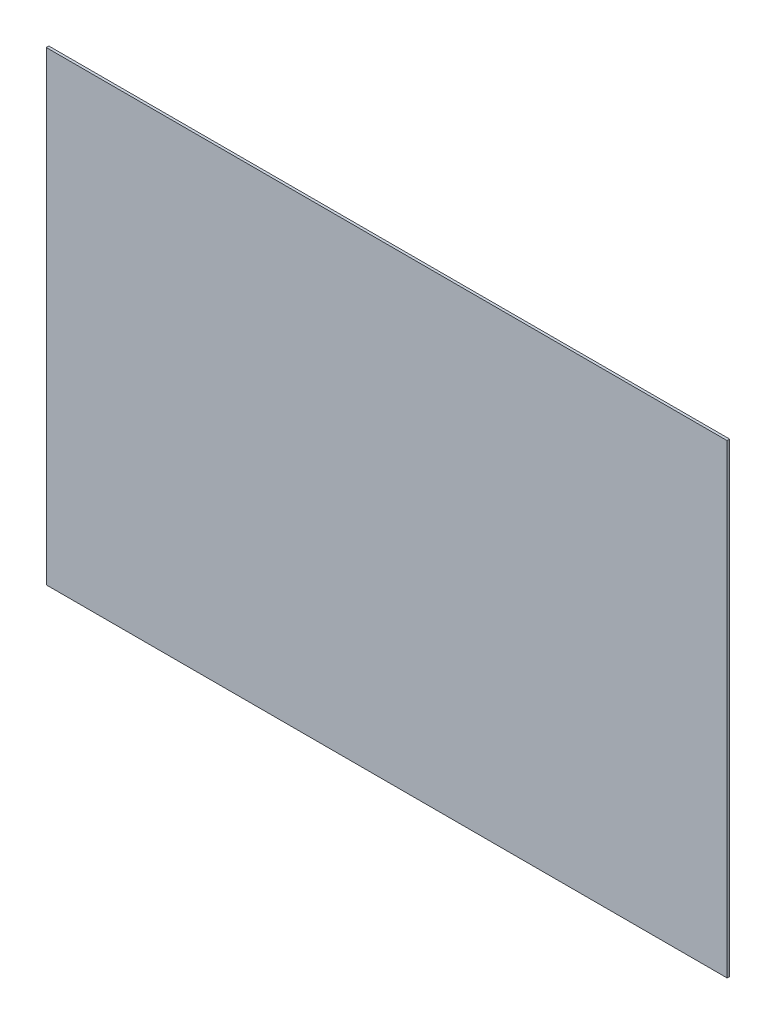
ISO-10303-21;
HEADER;
FILE_DESCRIPTION(('STEP AP214'),'2;1');
FILE_NAME('part.step','',(''),(''),'','','');
FILE_SCHEMA(('AUTOMOTIVE_DESIGN { 1 0 10303 214 1 1 1 1 }'));
ENDSEC;
DATA;
#1=APPLICATION_CONTEXT('core data for automotive mechanical design processes');
#2=APPLICATION_PROTOCOL_DEFINITION('international standard','automotive_design',2000,#1);
#3=PRODUCT_CONTEXT('',#1,'mechanical');
#4=PRODUCT('Part','Part','',(#3));
#5=PRODUCT_RELATED_PRODUCT_CATEGORY('part','',(#4));
#6=PRODUCT_DEFINITION_FORMATION('','',#4);
#7=PRODUCT_DEFINITION_CONTEXT('part definition',#1,'design');
#8=PRODUCT_DEFINITION('design','',#6,#7);
#9=PRODUCT_DEFINITION_SHAPE('','',#8);
#10=(LENGTH_UNIT() NAMED_UNIT(*) SI_UNIT(.MILLI.,.METRE.));
#11=(NAMED_UNIT(*) PLANE_ANGLE_UNIT() SI_UNIT($,.RADIAN.));
#12=(NAMED_UNIT(*) SI_UNIT($,.STERADIAN.) SOLID_ANGLE_UNIT());
#13=UNCERTAINTY_MEASURE_WITH_UNIT(LENGTH_MEASURE(1.E-05),#10,'distance_accuracy_value','');
#14=(GEOMETRIC_REPRESENTATION_CONTEXT(3) GLOBAL_UNCERTAINTY_ASSIGNED_CONTEXT((#13)) GLOBAL_UNIT_ASSIGNED_CONTEXT((#10,
#11,#12)) REPRESENTATION_CONTEXT('',''));
#15=CARTESIAN_POINT('',(0.,0.,0.));
#16=DIRECTION('',(0.,0.,1.));
#17=DIRECTION('',(1.,0.,0.));
#18=AXIS2_PLACEMENT_3D('',#15,#16,#17);
#19=CARTESIAN_POINT('',(395.,-270.,3.));
#20=DIRECTION('',(-1.,0.,0.));
#21=DIRECTION('',(0.,0.,1.));
#22=AXIS2_PLACEMENT_3D('',#19,#20,#21);
#23=PLANE('',#22);
#24=DIRECTION('',(0.,1.,0.));
#25=VECTOR('',#24,1.);
#26=CARTESIAN_POINT('',(395.,-270.,0.));
#27=LINE('',#26,#25);
#28=CARTESIAN_POINT('',(395.,-270.,0.));
#29=VERTEX_POINT('',#28);
#30=CARTESIAN_POINT('',(395.,270.,0.));
#31=VERTEX_POINT('',#30);
#32=EDGE_CURVE('E95',#29,#31,#27,.T.);
#33=ORIENTED_EDGE('',*,*,#32,.T.);
#34=DIRECTION('',(0.,0.,-1.));
#35=VECTOR('',#34,1.);
#36=CARTESIAN_POINT('',(395.,270.,3.));
#37=LINE('',#36,#35);
#38=CARTESIAN_POINT('',(395.,270.,3.));
#39=VERTEX_POINT('',#38);
#40=EDGE_CURVE('E11',#39,#31,#37,.T.);
#41=ORIENTED_EDGE('',*,*,#40,.F.);
#42=DIRECTION('',(0.,1.,0.));
#43=VECTOR('',#42,1.);
#44=CARTESIAN_POINT('',(395.,-270.,3.));
#45=LINE('',#44,#43);
#46=CARTESIAN_POINT('',(395.,-270.,3.));
#47=VERTEX_POINT('',#46);
#48=EDGE_CURVE('E83',#47,#39,#45,.T.);
#49=ORIENTED_EDGE('',*,*,#48,.F.);
#50=DIRECTION('',(0.,0.,-1.));
#51=VECTOR('',#50,1.);
#52=CARTESIAN_POINT('',(395.,-270.,3.));
#53=LINE('',#52,#51);
#54=EDGE_CURVE('E91',#47,#29,#53,.T.);
#55=ORIENTED_EDGE('',*,*,#54,.T.);
#56=EDGE_LOOP('',(#33,#41,#49,#55));
#57=FACE_BOUND('',#56,.T.);
#58=ADVANCED_FACE('F32',(#57),#23,.F.);
#59=CARTESIAN_POINT('',(-395.,270.,3.));
#60=DIRECTION('',(0.,-1.,0.));
#61=DIRECTION('',(0.,0.,-1.));
#62=AXIS2_PLACEMENT_3D('',#59,#60,#61);
#63=PLANE('',#62);
#64=DIRECTION('',(-1.,0.,0.));
#65=VECTOR('',#64,1.);
#66=CARTESIAN_POINT('',(-395.,270.,0.));
#67=LINE('',#66,#65);
#68=CARTESIAN_POINT('',(-395.,270.,0.));
#69=VERTEX_POINT('',#68);
#70=EDGE_CURVE('E87',#31,#69,#67,.T.);
#71=ORIENTED_EDGE('',*,*,#70,.T.);
#72=DIRECTION('',(0.,0.,-1.));
#73=VECTOR('',#72,1.);
#74=CARTESIAN_POINT('',(-395.,270.,3.));
#75=LINE('',#74,#73);
#76=CARTESIAN_POINT('',(-395.,270.,3.));
#77=VERTEX_POINT('',#76);
#78=EDGE_CURVE('E40',#77,#69,#75,.T.);
#79=ORIENTED_EDGE('',*,*,#78,.F.);
#80=DIRECTION('',(-1.,0.,0.));
#81=VECTOR('',#80,1.);
#82=CARTESIAN_POINT('',(-395.,270.,3.));
#83=LINE('',#82,#81);
#84=EDGE_CURVE('E78',#39,#77,#83,.T.);
#85=ORIENTED_EDGE('',*,*,#84,.F.);
#86=ORIENTED_EDGE('',*,*,#40,.T.);
#87=EDGE_LOOP('',(#71,#79,#85,#86));
#88=FACE_BOUND('',#87,.T.);
#89=ADVANCED_FACE('F86',(#88),#63,.F.);
#90=CARTESIAN_POINT('',(-395.,-270.,3.));
#91=DIRECTION('',(1.,0.,0.));
#92=DIRECTION('',(0.,0.,-1.));
#93=AXIS2_PLACEMENT_3D('',#90,#91,#92);
#94=PLANE('',#93);
#95=DIRECTION('',(0.,-1.,0.));
#96=VECTOR('',#95,1.);
#97=CARTESIAN_POINT('',(-395.,-270.,0.));
#98=LINE('',#97,#96);
#99=CARTESIAN_POINT('',(-395.,-270.,0.));
#100=VERTEX_POINT('',#99);
#101=EDGE_CURVE('E65',#69,#100,#98,.T.);
#102=ORIENTED_EDGE('',*,*,#101,.T.);
#103=DIRECTION('',(0.,0.,-1.));
#104=VECTOR('',#103,1.);
#105=CARTESIAN_POINT('',(-395.,-270.,3.));
#106=LINE('',#105,#104);
#107=CARTESIAN_POINT('',(-395.,-270.,3.));
#108=VERTEX_POINT('',#107);
#109=EDGE_CURVE('E88',#108,#100,#106,.T.);
#110=ORIENTED_EDGE('',*,*,#109,.F.);
#111=DIRECTION('',(0.,-1.,0.));
#112=VECTOR('',#111,1.);
#113=CARTESIAN_POINT('',(-395.,-270.,3.));
#114=LINE('',#113,#112);
#115=EDGE_CURVE('E81',#77,#108,#114,.T.);
#116=ORIENTED_EDGE('',*,*,#115,.F.);
#117=ORIENTED_EDGE('',*,*,#78,.T.);
#118=EDGE_LOOP('',(#102,#110,#116,#117));
#119=FACE_BOUND('',#118,.T.);
#120=ADVANCED_FACE('F89',(#119),#94,.F.);
#121=CARTESIAN_POINT('',(-395.,-270.,3.));
#122=DIRECTION('',(0.,1.,0.));
#123=DIRECTION('',(0.,0.,1.));
#124=AXIS2_PLACEMENT_3D('',#121,#122,#123);
#125=PLANE('',#124);
#126=DIRECTION('',(1.,0.,0.));
#127=VECTOR('',#126,1.);
#128=CARTESIAN_POINT('',(-395.,-270.,0.));
#129=LINE('',#128,#127);
#130=EDGE_CURVE('E71',#100,#29,#129,.T.);
#131=ORIENTED_EDGE('',*,*,#130,.T.);
#132=ORIENTED_EDGE('',*,*,#54,.F.);
#133=DIRECTION('',(1.,0.,0.));
#134=VECTOR('',#133,1.);
#135=CARTESIAN_POINT('',(-395.,-270.,3.));
#136=LINE('',#135,#134);
#137=EDGE_CURVE('E48',#108,#47,#136,.T.);
#138=ORIENTED_EDGE('',*,*,#137,.F.);
#139=ORIENTED_EDGE('',*,*,#109,.T.);
#140=EDGE_LOOP('',(#131,#132,#138,#139));
#141=FACE_BOUND('',#140,.T.);
#142=ADVANCED_FACE('F102',(#141),#125,.F.);
#143=CARTESIAN_POINT('',(0.,0.,3.));
#144=DIRECTION('',(0.,0.,-1.));
#145=DIRECTION('',(-1.,0.,0.));
#146=AXIS2_PLACEMENT_3D('',#143,#144,#145);
#147=PLANE('',#146);
#148=ORIENTED_EDGE('',*,*,#48,.T.);
#149=ORIENTED_EDGE('',*,*,#84,.T.);
#150=ORIENTED_EDGE('',*,*,#115,.T.);
#151=ORIENTED_EDGE('',*,*,#137,.T.);
#152=EDGE_LOOP('',(#148,#149,#150,#151));
#153=FACE_BOUND('',#152,.T.);
#154=ADVANCED_FACE('F79',(#153),#147,.F.);
#155=CARTESIAN_POINT('',(0.,0.,0.));
#156=DIRECTION('',(0.,0.,-1.));
#157=DIRECTION('',(-1.,0.,0.));
#158=AXIS2_PLACEMENT_3D('',#155,#156,#157);
#159=PLANE('',#158);
#160=ORIENTED_EDGE('',*,*,#32,.F.);
#161=ORIENTED_EDGE('',*,*,#130,.F.);
#162=ORIENTED_EDGE('',*,*,#101,.F.);
#163=ORIENTED_EDGE('',*,*,#70,.F.);
#164=EDGE_LOOP('',(#160,#161,#162,#163));
#165=FACE_BOUND('',#164,.T.);
#166=ADVANCED_FACE('F105',(#165),#159,.T.);
#167=CLOSED_SHELL('',(#58,#89,#120,#142,#154,#166));
#168=MANIFOLD_SOLID_BREP('B2',#167);
#169=ADVANCED_BREP_SHAPE_REPRESENTATION('',(#18,#168),#14);
#170=SHAPE_DEFINITION_REPRESENTATION(#9,#169);
ENDSEC;
END-ISO-10303-21;
